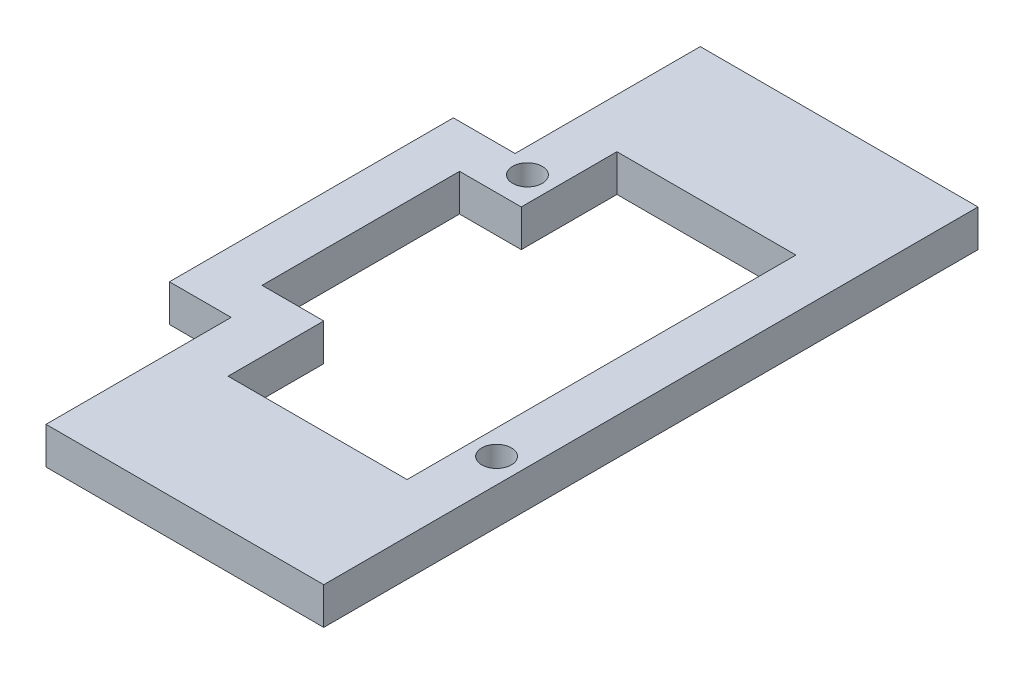
ISO-10303-21;
HEADER;
FILE_DESCRIPTION(('STEP AP214'),'2;1');
FILE_NAME('part.step','',(''),(''),'','','');
FILE_SCHEMA(('AUTOMOTIVE_DESIGN { 1 0 10303 214 1 1 1 1 }'));
ENDSEC;
DATA;
#1=APPLICATION_CONTEXT('core data for automotive mechanical design processes');
#2=APPLICATION_PROTOCOL_DEFINITION('international standard','automotive_design',2000,#1);
#3=PRODUCT_CONTEXT('',#1,'mechanical');
#4=PRODUCT('Part','Part','',(#3));
#5=PRODUCT_RELATED_PRODUCT_CATEGORY('part','',(#4));
#6=PRODUCT_DEFINITION_FORMATION('','',#4);
#7=PRODUCT_DEFINITION_CONTEXT('part definition',#1,'design');
#8=PRODUCT_DEFINITION('design','',#6,#7);
#9=PRODUCT_DEFINITION_SHAPE('','',#8);
#10=(LENGTH_UNIT() NAMED_UNIT(*) SI_UNIT(.MILLI.,.METRE.));
#11=(NAMED_UNIT(*) PLANE_ANGLE_UNIT() SI_UNIT($,.RADIAN.));
#12=(NAMED_UNIT(*) SI_UNIT($,.STERADIAN.) SOLID_ANGLE_UNIT());
#13=UNCERTAINTY_MEASURE_WITH_UNIT(LENGTH_MEASURE(1.E-05),#10,'distance_accuracy_value','');
#14=(GEOMETRIC_REPRESENTATION_CONTEXT(3) GLOBAL_UNCERTAINTY_ASSIGNED_CONTEXT((#13)) GLOBAL_UNIT_ASSIGNED_CONTEXT((#10,
#11,#12)) REPRESENTATION_CONTEXT('',''));
#15=CARTESIAN_POINT('',(0.,0.,0.));
#16=DIRECTION('',(0.,0.,1.));
#17=DIRECTION('',(1.,0.,0.));
#18=AXIS2_PLACEMENT_3D('',#15,#16,#17);
#19=CARTESIAN_POINT('',(-1.73819143978702,6.,0.));
#20=DIRECTION('',(1.,0.,0.));
#21=DIRECTION('',(0.,0.,-1.));
#22=AXIS2_PLACEMENT_3D('',#19,#20,#21);
#23=PLANE('',#22);
#24=DIRECTION('',(0.,0.,1.));
#25=VECTOR('',#24,1.);
#26=CARTESIAN_POINT('',(-1.73819143978702,0.,0.));
#27=LINE('',#26,#25);
#28=CARTESIAN_POINT('',(-1.73819143978702,0.,2.01519907728627));
#29=VERTEX_POINT('',#28);
#30=CARTESIAN_POINT('',(-1.73819143978701,0.,17.5151990772863));
#31=VERTEX_POINT('',#30);
#32=EDGE_CURVE('E231',#29,#31,#27,.T.);
#33=ORIENTED_EDGE('',*,*,#32,.F.);
#34=DIRECTION('',(0.,-1.,0.));
#35=VECTOR('',#34,1.);
#36=CARTESIAN_POINT('',(-1.73819143978702,6.,2.01519907728627));
#37=LINE('',#36,#35);
#38=CARTESIAN_POINT('',(-1.73819143978702,6.,2.01519907728627));
#39=VERTEX_POINT('',#38);
#40=EDGE_CURVE('E11',#39,#29,#37,.T.);
#41=ORIENTED_EDGE('',*,*,#40,.F.);
#42=DIRECTION('',(0.,0.,1.));
#43=VECTOR('',#42,1.);
#44=CARTESIAN_POINT('',(-1.73819143978702,6.,0.));
#45=LINE('',#44,#43);
#46=CARTESIAN_POINT('',(-1.73819143978701,6.,17.5151990772863));
#47=VERTEX_POINT('',#46);
#48=EDGE_CURVE('E267',#39,#47,#45,.T.);
#49=ORIENTED_EDGE('',*,*,#48,.T.);
#50=DIRECTION('',(0.,-1.,0.));
#51=VECTOR('',#50,1.);
#52=CARTESIAN_POINT('',(-1.73819143978701,6.,17.5151990772863));
#53=LINE('',#52,#51);
#54=EDGE_CURVE('E56',#47,#31,#53,.T.);
#55=ORIENTED_EDGE('',*,*,#54,.T.);
#56=EDGE_LOOP('',(#33,#41,#49,#55));
#57=FACE_BOUND('',#56,.T.);
#58=ADVANCED_FACE('F37',(#57),#23,.T.);
#59=CARTESIAN_POINT('',(0.,6.,2.01519907728627));
#60=DIRECTION('',(0.,0.,1.));
#61=DIRECTION('',(1.,0.,0.));
#62=AXIS2_PLACEMENT_3D('',#59,#60,#61);
#63=PLANE('',#62);
#64=DIRECTION('',(-1.,0.,0.));
#65=VECTOR('',#64,1.);
#66=CARTESIAN_POINT('',(0.,0.,2.01519907728627));
#67=LINE('',#66,#65);
#68=CARTESIAN_POINT('',(-11.738191439787,0.,2.01519907728627));
#69=VERTEX_POINT('',#68);
#70=EDGE_CURVE('E228',#29,#69,#67,.T.);
#71=ORIENTED_EDGE('',*,*,#70,.T.);
#72=DIRECTION('',(0.,-1.,0.));
#73=VECTOR('',#72,1.);
#74=CARTESIAN_POINT('',(-11.738191439787,6.,2.01519907728627));
#75=LINE('',#74,#73);
#76=CARTESIAN_POINT('',(-11.738191439787,6.,2.01519907728627));
#77=VERTEX_POINT('',#76);
#78=EDGE_CURVE('E47',#77,#69,#75,.T.);
#79=ORIENTED_EDGE('',*,*,#78,.F.);
#80=DIRECTION('',(-1.,0.,0.));
#81=VECTOR('',#80,1.);
#82=CARTESIAN_POINT('',(0.,6.,2.01519907728627));
#83=LINE('',#82,#81);
#84=EDGE_CURVE('E265',#39,#77,#83,.T.);
#85=ORIENTED_EDGE('',*,*,#84,.F.);
#86=ORIENTED_EDGE('',*,*,#40,.T.);
#87=EDGE_LOOP('',(#71,#79,#85,#86));
#88=FACE_BOUND('',#87,.T.);
#89=ADVANCED_FACE('F330',(#88),#63,.F.);
#90=CARTESIAN_POINT('',(-11.738191439787,6.,0.));
#91=DIRECTION('',(1.,0.,0.));
#92=DIRECTION('',(0.,0.,-1.));
#93=AXIS2_PLACEMENT_3D('',#90,#91,#92);
#94=PLANE('',#93);
#95=DIRECTION('',(0.,0.,1.));
#96=VECTOR('',#95,1.);
#97=CARTESIAN_POINT('',(-11.738191439787,0.,0.));
#98=LINE('',#97,#96);
#99=CARTESIAN_POINT('',(-11.738191439787,0.,-29.9848009227137));
#100=VERTEX_POINT('',#99);
#101=EDGE_CURVE('E225',#100,#69,#98,.T.);
#102=ORIENTED_EDGE('',*,*,#101,.F.);
#103=DIRECTION('',(0.,-1.,0.));
#104=VECTOR('',#103,1.);
#105=CARTESIAN_POINT('',(-11.738191439787,6.,-29.9848009227137));
#106=LINE('',#105,#104);
#107=CARTESIAN_POINT('',(-11.738191439787,6.,-29.9848009227137));
#108=VERTEX_POINT('',#107);
#109=EDGE_CURVE('E188',#108,#100,#106,.T.);
#110=ORIENTED_EDGE('',*,*,#109,.F.);
#111=DIRECTION('',(0.,0.,1.));
#112=VECTOR('',#111,1.);
#113=CARTESIAN_POINT('',(-11.738191439787,6.,0.));
#114=LINE('',#113,#112);
#115=EDGE_CURVE('E262',#108,#77,#114,.T.);
#116=ORIENTED_EDGE('',*,*,#115,.T.);
#117=ORIENTED_EDGE('',*,*,#78,.T.);
#118=EDGE_LOOP('',(#102,#110,#116,#117));
#119=FACE_BOUND('',#118,.T.);
#120=ADVANCED_FACE('F336',(#119),#94,.T.);
#121=CARTESIAN_POINT('',(0.,6.,-29.9848009227137));
#122=DIRECTION('',(0.,0.,1.));
#123=DIRECTION('',(1.,0.,0.));
#124=AXIS2_PLACEMENT_3D('',#121,#122,#123);
#125=PLANE('',#124);
#126=DIRECTION('',(-1.,0.,0.));
#127=VECTOR('',#126,1.);
#128=CARTESIAN_POINT('',(0.,0.,-29.9848009227137));
#129=LINE('',#128,#127);
#130=CARTESIAN_POINT('',(-1.73819143978702,0.,-29.9848009227137));
#131=VERTEX_POINT('',#130);
#132=EDGE_CURVE('E222',#131,#100,#129,.T.);
#133=ORIENTED_EDGE('',*,*,#132,.F.);
#134=DIRECTION('',(0.,-1.,0.));
#135=VECTOR('',#134,1.);
#136=CARTESIAN_POINT('',(-1.73819143978702,6.,-29.9848009227137));
#137=LINE('',#136,#135);
#138=CARTESIAN_POINT('',(-1.73819143978702,6.,-29.9848009227137));
#139=VERTEX_POINT('',#138);
#140=EDGE_CURVE('E182',#139,#131,#137,.T.);
#141=ORIENTED_EDGE('',*,*,#140,.F.);
#142=DIRECTION('',(-1.,0.,0.));
#143=VECTOR('',#142,1.);
#144=CARTESIAN_POINT('',(0.,6.,-29.9848009227137));
#145=LINE('',#144,#143);
#146=EDGE_CURVE('E259',#139,#108,#145,.T.);
#147=ORIENTED_EDGE('',*,*,#146,.T.);
#148=ORIENTED_EDGE('',*,*,#109,.T.);
#149=EDGE_LOOP('',(#133,#141,#147,#148));
#150=FACE_BOUND('',#149,.T.);
#151=ADVANCED_FACE('F342',(#150),#125,.T.);
#152=CARTESIAN_POINT('',(-1.73819143978702,0.,-45.4848009227137));
#153=VERTEX_POINT('',#152);
#154=EDGE_CURVE('E221',#153,#131,#27,.T.);
#155=ORIENTED_EDGE('',*,*,#154,.F.);
#156=DIRECTION('',(0.,-1.,0.));
#157=VECTOR('',#156,1.);
#158=CARTESIAN_POINT('',(-1.73819143978702,6.,-45.4848009227137));
#159=LINE('',#158,#157);
#160=CARTESIAN_POINT('',(-1.73819143978702,6.,-45.4848009227137));
#161=VERTEX_POINT('',#160);
#162=EDGE_CURVE('E180',#161,#153,#159,.T.);
#163=ORIENTED_EDGE('',*,*,#162,.F.);
#164=EDGE_CURVE('E174',#161,#139,#45,.T.);
#165=ORIENTED_EDGE('',*,*,#164,.T.);
#166=ORIENTED_EDGE('',*,*,#140,.T.);
#167=EDGE_LOOP('',(#155,#163,#165,#166));
#168=FACE_BOUND('',#167,.T.);
#169=ADVANCED_FACE('F332',(#168),#23,.T.);
#170=CARTESIAN_POINT('',(0.,6.,-45.4848009227137));
#171=DIRECTION('',(0.,0.,-1.));
#172=DIRECTION('',(-1.,0.,0.));
#173=AXIS2_PLACEMENT_3D('',#170,#171,#172);
#174=PLANE('',#173);
#175=DIRECTION('',(1.,0.,0.));
#176=VECTOR('',#175,1.);
#177=CARTESIAN_POINT('',(0.,0.,-45.4848009227137));
#178=LINE('',#177,#176);
#179=CARTESIAN_POINT('',(27.261808560213,0.,-45.4848009227137));
#180=VERTEX_POINT('',#179);
#181=EDGE_CURVE('E179',#153,#180,#178,.T.);
#182=ORIENTED_EDGE('',*,*,#181,.T.);
#183=DIRECTION('',(0.,-1.,0.));
#184=VECTOR('',#183,1.);
#185=CARTESIAN_POINT('',(27.261808560213,6.,-45.4848009227137));
#186=LINE('',#185,#184);
#187=CARTESIAN_POINT('',(27.261808560213,6.,-45.4848009227137));
#188=VERTEX_POINT('',#187);
#189=EDGE_CURVE('E161',#188,#180,#186,.T.);
#190=ORIENTED_EDGE('',*,*,#189,.F.);
#191=DIRECTION('',(1.,0.,0.));
#192=VECTOR('',#191,1.);
#193=CARTESIAN_POINT('',(0.,6.,-45.4848009227137));
#194=LINE('',#193,#192);
#195=EDGE_CURVE('E166',#161,#188,#194,.T.);
#196=ORIENTED_EDGE('',*,*,#195,.F.);
#197=ORIENTED_EDGE('',*,*,#162,.T.);
#198=EDGE_LOOP('',(#182,#190,#196,#197));
#199=FACE_BOUND('',#198,.T.);
#200=ADVANCED_FACE('F177',(#199),#174,.F.);
#201=CARTESIAN_POINT('',(27.261808560213,6.,0.));
#202=DIRECTION('',(1.,0.,0.));
#203=DIRECTION('',(0.,0.,-1.));
#204=AXIS2_PLACEMENT_3D('',#201,#202,#203);
#205=PLANE('',#204);
#206=DIRECTION('',(0.,0.,1.));
#207=VECTOR('',#206,1.);
#208=CARTESIAN_POINT('',(27.261808560213,0.,0.));
#209=LINE('',#208,#207);
#210=CARTESIAN_POINT('',(27.261808560213,0.,17.5151990772863));
#211=VERTEX_POINT('',#210);
#212=EDGE_CURVE('E218',#180,#211,#209,.T.);
#213=ORIENTED_EDGE('',*,*,#212,.T.);
#214=DIRECTION('',(0.,-1.,0.));
#215=VECTOR('',#214,1.);
#216=CARTESIAN_POINT('',(27.261808560213,6.,17.5151990772863));
#217=LINE('',#216,#215);
#218=CARTESIAN_POINT('',(27.261808560213,6.,17.5151990772863));
#219=VERTEX_POINT('',#218);
#220=EDGE_CURVE('E106',#219,#211,#217,.T.);
#221=ORIENTED_EDGE('',*,*,#220,.F.);
#222=DIRECTION('',(0.,0.,1.));
#223=VECTOR('',#222,1.);
#224=CARTESIAN_POINT('',(27.261808560213,6.,0.));
#225=LINE('',#224,#223);
#226=EDGE_CURVE('E157',#188,#219,#225,.T.);
#227=ORIENTED_EDGE('',*,*,#226,.F.);
#228=ORIENTED_EDGE('',*,*,#189,.T.);
#229=EDGE_LOOP('',(#213,#221,#227,#228));
#230=FACE_BOUND('',#229,.T.);
#231=ADVANCED_FACE('F159',(#230),#205,.F.);
#232=CARTESIAN_POINT('',(0.,6.,9.01519907728628));
#233=DIRECTION('',(0.,0.,1.));
#234=DIRECTION('',(1.,0.,0.));
#235=AXIS2_PLACEMENT_3D('',#232,#233,#234);
#236=PLANE('',#235);
#237=DIRECTION('',(-1.,0.,0.));
#238=VECTOR('',#237,1.);
#239=CARTESIAN_POINT('',(0.,0.,9.01519907728628));
#240=LINE('',#239,#238);
#241=CARTESIAN_POINT('',(-9.73819143978701,0.,9.01519907728628));
#242=VERTEX_POINT('',#241);
#243=CARTESIAN_POINT('',(-19.738191439787,0.,9.01519907728628));
#244=VERTEX_POINT('',#243);
#245=EDGE_CURVE('E255',#242,#244,#240,.T.);
#246=ORIENTED_EDGE('',*,*,#245,.F.);
#247=DIRECTION('',(0.,-1.,0.));
#248=VECTOR('',#247,1.);
#249=CARTESIAN_POINT('',(-9.73819143978701,6.,9.01519907728628));
#250=LINE('',#249,#248);
#251=CARTESIAN_POINT('',(-9.73819143978701,6.,9.01519907728628));
#252=VERTEX_POINT('',#251);
#253=EDGE_CURVE('E41',#252,#242,#250,.T.);
#254=ORIENTED_EDGE('',*,*,#253,.F.);
#255=DIRECTION('',(-1.,0.,0.));
#256=VECTOR('',#255,1.);
#257=CARTESIAN_POINT('',(0.,6.,9.01519907728628));
#258=LINE('',#257,#256);
#259=CARTESIAN_POINT('',(-19.738191439787,6.,9.01519907728628));
#260=VERTEX_POINT('',#259);
#261=EDGE_CURVE('E217',#252,#260,#258,.T.);
#262=ORIENTED_EDGE('',*,*,#261,.T.);
#263=DIRECTION('',(0.,-1.,0.));
#264=VECTOR('',#263,1.);
#265=CARTESIAN_POINT('',(-19.738191439787,6.,9.01519907728628));
#266=LINE('',#265,#264);
#267=EDGE_CURVE('E191',#260,#244,#266,.T.);
#268=ORIENTED_EDGE('',*,*,#267,.T.);
#269=EDGE_LOOP('',(#246,#254,#262,#268));
#270=FACE_BOUND('',#269,.T.);
#271=ADVANCED_FACE('F39',(#270),#236,.T.);
#272=CARTESIAN_POINT('',(-9.73819143978702,6.,0.));
#273=DIRECTION('',(1.,0.,0.));
#274=DIRECTION('',(0.,0.,-1.));
#275=AXIS2_PLACEMENT_3D('',#272,#273,#274);
#276=PLANE('',#275);
#277=DIRECTION('',(0.,0.,1.));
#278=VECTOR('',#277,1.);
#279=CARTESIAN_POINT('',(-9.73819143978702,0.,0.));
#280=LINE('',#279,#278);
#281=CARTESIAN_POINT('',(-9.73819143978701,0.,39.0151990772863));
#282=VERTEX_POINT('',#281);
#283=EDGE_CURVE('E253',#242,#282,#280,.T.);
#284=ORIENTED_EDGE('',*,*,#283,.T.);
#285=DIRECTION('',(0.,-1.,0.));
#286=VECTOR('',#285,1.);
#287=CARTESIAN_POINT('',(-9.73819143978701,6.,39.0151990772863));
#288=LINE('',#287,#286);
#289=CARTESIAN_POINT('',(-9.73819143978701,6.,39.0151990772863));
#290=VERTEX_POINT('',#289);
#291=EDGE_CURVE('E204',#290,#282,#288,.T.);
#292=ORIENTED_EDGE('',*,*,#291,.F.);
#293=DIRECTION('',(0.,0.,1.));
#294=VECTOR('',#293,1.);
#295=CARTESIAN_POINT('',(-9.73819143978702,6.,0.));
#296=LINE('',#295,#294);
#297=EDGE_CURVE('E288',#252,#290,#296,.T.);
#298=ORIENTED_EDGE('',*,*,#297,.F.);
#299=ORIENTED_EDGE('',*,*,#253,.T.);
#300=EDGE_LOOP('',(#284,#292,#298,#299));
#301=FACE_BOUND('',#300,.T.);
#302=ADVANCED_FACE('F304',(#301),#276,.F.);
#303=CARTESIAN_POINT('',(0.,6.,39.0151990772863));
#304=DIRECTION('',(0.,0.,-1.));
#305=DIRECTION('',(-1.,0.,0.));
#306=AXIS2_PLACEMENT_3D('',#303,#304,#305);
#307=PLANE('',#306);
#308=DIRECTION('',(1.,0.,0.));
#309=VECTOR('',#308,1.);
#310=CARTESIAN_POINT('',(0.,0.,39.0151990772863));
#311=LINE('',#310,#309);
#312=CARTESIAN_POINT('',(35.261808560213,0.,39.0151990772863));
#313=VERTEX_POINT('',#312);
#314=EDGE_CURVE('E251',#282,#313,#311,.T.);
#315=ORIENTED_EDGE('',*,*,#314,.T.);
#316=DIRECTION('',(0.,-1.,0.));
#317=VECTOR('',#316,1.);
#318=CARTESIAN_POINT('',(35.261808560213,6.,39.0151990772863));
#319=LINE('',#318,#317);
#320=CARTESIAN_POINT('',(35.261808560213,6.,39.0151990772863));
#321=VERTEX_POINT('',#320);
#322=EDGE_CURVE('E203',#321,#313,#319,.T.);
#323=ORIENTED_EDGE('',*,*,#322,.F.);
#324=DIRECTION('',(1.,0.,0.));
#325=VECTOR('',#324,1.);
#326=CARTESIAN_POINT('',(0.,6.,39.0151990772863));
#327=LINE('',#326,#325);
#328=EDGE_CURVE('E286',#290,#321,#327,.T.);
#329=ORIENTED_EDGE('',*,*,#328,.F.);
#330=ORIENTED_EDGE('',*,*,#291,.T.);
#331=EDGE_LOOP('',(#315,#323,#329,#330));
#332=FACE_BOUND('',#331,.T.);
#333=ADVANCED_FACE('F306',(#332),#307,.F.);
#334=CARTESIAN_POINT('',(35.261808560213,6.,0.));
#335=DIRECTION('',(1.,0.,0.));
#336=DIRECTION('',(0.,0.,-1.));
#337=AXIS2_PLACEMENT_3D('',#334,#335,#336);
#338=PLANE('',#337);
#339=DIRECTION('',(0.,0.,1.));
#340=VECTOR('',#339,1.);
#341=CARTESIAN_POINT('',(35.261808560213,0.,0.));
#342=LINE('',#341,#340);
#343=CARTESIAN_POINT('',(35.261808560213,0.,-66.9848009227137));
#344=VERTEX_POINT('',#343);
#345=EDGE_CURVE('E248',#344,#313,#342,.T.);
#346=ORIENTED_EDGE('',*,*,#345,.F.);
#347=DIRECTION('',(0.,-1.,0.));
#348=VECTOR('',#347,1.);
#349=CARTESIAN_POINT('',(35.261808560213,6.,-66.9848009227137));
#350=LINE('',#349,#348);
#351=CARTESIAN_POINT('',(35.261808560213,6.,-66.9848009227137));
#352=VERTEX_POINT('',#351);
#353=EDGE_CURVE('E201',#352,#344,#350,.T.);
#354=ORIENTED_EDGE('',*,*,#353,.F.);
#355=DIRECTION('',(0.,0.,1.));
#356=VECTOR('',#355,1.);
#357=CARTESIAN_POINT('',(35.261808560213,6.,0.));
#358=LINE('',#357,#356);
#359=EDGE_CURVE('E283',#352,#321,#358,.T.);
#360=ORIENTED_EDGE('',*,*,#359,.T.);
#361=ORIENTED_EDGE('',*,*,#322,.T.);
#362=EDGE_LOOP('',(#346,#354,#360,#361));
#363=FACE_BOUND('',#362,.T.);
#364=ADVANCED_FACE('F321',(#363),#338,.T.);
#365=CARTESIAN_POINT('',(0.,6.,-66.9848009227137));
#366=DIRECTION('',(0.,0.,-1.));
#367=DIRECTION('',(-1.,0.,0.));
#368=AXIS2_PLACEMENT_3D('',#365,#366,#367);
#369=PLANE('',#368);
#370=DIRECTION('',(1.,0.,0.));
#371=VECTOR('',#370,1.);
#372=CARTESIAN_POINT('',(0.,0.,-66.9848009227137));
#373=LINE('',#372,#371);
#374=CARTESIAN_POINT('',(-9.73819143978703,0.,-66.9848009227137));
#375=VERTEX_POINT('',#374);
#376=EDGE_CURVE('E245',#375,#344,#373,.T.);
#377=ORIENTED_EDGE('',*,*,#376,.F.);
#378=DIRECTION('',(0.,-1.,0.));
#379=VECTOR('',#378,1.);
#380=CARTESIAN_POINT('',(-9.73819143978703,6.,-66.9848009227137));
#381=LINE('',#380,#379);
#382=CARTESIAN_POINT('',(-9.73819143978703,6.,-66.9848009227137));
#383=VERTEX_POINT('',#382);
#384=EDGE_CURVE('E199',#383,#375,#381,.T.);
#385=ORIENTED_EDGE('',*,*,#384,.F.);
#386=DIRECTION('',(1.,0.,0.));
#387=VECTOR('',#386,1.);
#388=CARTESIAN_POINT('',(0.,6.,-66.9848009227137));
#389=LINE('',#388,#387);
#390=EDGE_CURVE('E280',#383,#352,#389,.T.);
#391=ORIENTED_EDGE('',*,*,#390,.T.);
#392=ORIENTED_EDGE('',*,*,#353,.T.);
#393=EDGE_LOOP('',(#377,#385,#391,#392));
#394=FACE_BOUND('',#393,.T.);
#395=ADVANCED_FACE('F312',(#394),#369,.T.);
#396=CARTESIAN_POINT('',(-9.73819143978702,0.,-36.9848009227137));
#397=VERTEX_POINT('',#396);
#398=EDGE_CURVE('E244',#375,#397,#280,.T.);
#399=ORIENTED_EDGE('',*,*,#398,.T.);
#400=DIRECTION('',(0.,-1.,0.));
#401=VECTOR('',#400,1.);
#402=CARTESIAN_POINT('',(-9.73819143978702,6.,-36.9848009227137));
#403=LINE('',#402,#401);
#404=CARTESIAN_POINT('',(-9.73819143978702,6.,-36.9848009227137));
#405=VERTEX_POINT('',#404);
#406=EDGE_CURVE('E196',#405,#397,#403,.T.);
#407=ORIENTED_EDGE('',*,*,#406,.F.);
#408=EDGE_CURVE('E279',#383,#405,#296,.T.);
#409=ORIENTED_EDGE('',*,*,#408,.F.);
#410=ORIENTED_EDGE('',*,*,#384,.T.);
#411=EDGE_LOOP('',(#399,#407,#409,#410));
#412=FACE_BOUND('',#411,.T.);
#413=ADVANCED_FACE('F318',(#412),#276,.F.);
#414=CARTESIAN_POINT('',(0.,6.,-36.9848009227137));
#415=DIRECTION('',(0.,0.,1.));
#416=DIRECTION('',(1.,0.,0.));
#417=AXIS2_PLACEMENT_3D('',#414,#415,#416);
#418=PLANE('',#417);
#419=DIRECTION('',(-1.,0.,0.));
#420=VECTOR('',#419,1.);
#421=CARTESIAN_POINT('',(0.,0.,-36.9848009227137));
#422=LINE('',#421,#420);
#423=CARTESIAN_POINT('',(-19.738191439787,0.,-36.9848009227137));
#424=VERTEX_POINT('',#423);
#425=EDGE_CURVE('E242',#397,#424,#422,.T.);
#426=ORIENTED_EDGE('',*,*,#425,.T.);
#427=DIRECTION('',(0.,-1.,0.));
#428=VECTOR('',#427,1.);
#429=CARTESIAN_POINT('',(-19.738191439787,6.,-36.9848009227137));
#430=LINE('',#429,#428);
#431=CARTESIAN_POINT('',(-19.738191439787,6.,-36.9848009227137));
#432=VERTEX_POINT('',#431);
#433=EDGE_CURVE('E193',#432,#424,#430,.T.);
#434=ORIENTED_EDGE('',*,*,#433,.F.);
#435=DIRECTION('',(-1.,0.,0.));
#436=VECTOR('',#435,1.);
#437=CARTESIAN_POINT('',(0.,6.,-36.9848009227137));
#438=LINE('',#437,#436);
#439=EDGE_CURVE('E277',#405,#432,#438,.T.);
#440=ORIENTED_EDGE('',*,*,#439,.F.);
#441=ORIENTED_EDGE('',*,*,#406,.T.);
#442=EDGE_LOOP('',(#426,#434,#440,#441));
#443=FACE_BOUND('',#442,.T.);
#444=ADVANCED_FACE('F320',(#443),#418,.F.);
#445=CARTESIAN_POINT('',(-5.73819143978702,6.,-34.9848009227137));
#446=DIRECTION('',(0.,-1.,0.));
#447=DIRECTION('',(0.,0.,-1.));
#448=AXIS2_PLACEMENT_3D('',#445,#446,#447);
#449=CYLINDRICAL_SURFACE('',#448,2.4);
#450=CARTESIAN_POINT('',(-5.73819143978702,6.,-34.9848009227137));
#451=DIRECTION('',(0.,1.,0.));
#452=DIRECTION('',(0.,0.,1.));
#453=AXIS2_PLACEMENT_3D('',#450,#451,#452);
#454=CIRCLE('',#453,2.4);
#455=CARTESIAN_POINT('',(-5.73819143978702,6.,-32.5848009227137));
#456=VERTEX_POINT('',#455);
#457=EDGE_CURVE('E269',#456,#456,#454,.T.);
#458=ORIENTED_EDGE('',*,*,#457,.T.);
#459=EDGE_LOOP('',(#458));
#460=FACE_BOUND('',#459,.T.);
#461=CARTESIAN_POINT('',(-5.73819143978702,0.,-34.9848009227137));
#462=DIRECTION('',(0.,1.,0.));
#463=DIRECTION('',(0.,0.,1.));
#464=AXIS2_PLACEMENT_3D('',#461,#462,#463);
#465=CIRCLE('',#464,2.4);
#466=CARTESIAN_POINT('',(-5.73819143978702,0.,-32.5848009227137));
#467=VERTEX_POINT('',#466);
#468=EDGE_CURVE('E233',#467,#467,#465,.T.);
#469=ORIENTED_EDGE('',*,*,#468,.F.);
#470=EDGE_LOOP('',(#469));
#471=FACE_BOUND('',#470,.T.);
#472=ADVANCED_FACE('F381',(#460,#471),#449,.F.);
#473=CARTESIAN_POINT('',(31.261808560213,6.,7.01519907728627));
#474=DIRECTION('',(0.,-1.,0.));
#475=DIRECTION('',(0.,0.,-1.));
#476=AXIS2_PLACEMENT_3D('',#473,#474,#475);
#477=CYLINDRICAL_SURFACE('',#476,2.4);
#478=CARTESIAN_POINT('',(31.261808560213,6.,7.01519907728627));
#479=DIRECTION('',(0.,1.,0.));
#480=DIRECTION('',(0.,0.,1.));
#481=AXIS2_PLACEMENT_3D('',#478,#479,#480);
#482=CIRCLE('',#481,2.4);
#483=CARTESIAN_POINT('',(31.261808560213,6.,9.41519907728627));
#484=VERTEX_POINT('',#483);
#485=EDGE_CURVE('E272',#484,#484,#482,.T.);
#486=ORIENTED_EDGE('',*,*,#485,.T.);
#487=EDGE_LOOP('',(#486));
#488=FACE_BOUND('',#487,.T.);
#489=CARTESIAN_POINT('',(31.261808560213,0.,7.01519907728627));
#490=DIRECTION('',(0.,1.,0.));
#491=DIRECTION('',(0.,0.,1.));
#492=AXIS2_PLACEMENT_3D('',#489,#490,#491);
#493=CIRCLE('',#492,2.4);
#494=CARTESIAN_POINT('',(31.261808560213,0.,9.41519907728627));
#495=VERTEX_POINT('',#494);
#496=EDGE_CURVE('E236',#495,#495,#493,.T.);
#497=ORIENTED_EDGE('',*,*,#496,.F.);
#498=EDGE_LOOP('',(#497));
#499=FACE_BOUND('',#498,.T.);
#500=ADVANCED_FACE('F362',(#488,#499),#477,.F.);
#501=CARTESIAN_POINT('',(-19.738191439787,6.,0.));
#502=DIRECTION('',(1.,0.,0.));
#503=DIRECTION('',(0.,0.,-1.));
#504=AXIS2_PLACEMENT_3D('',#501,#502,#503);
#505=PLANE('',#504);
#506=DIRECTION('',(0.,0.,1.));
#507=VECTOR('',#506,1.);
#508=CARTESIAN_POINT('',(-19.738191439787,0.,0.));
#509=LINE('',#508,#507);
#510=EDGE_CURVE('E239',#424,#244,#509,.T.);
#511=ORIENTED_EDGE('',*,*,#510,.T.);
#512=ORIENTED_EDGE('',*,*,#267,.F.);
#513=DIRECTION('',(0.,0.,1.));
#514=VECTOR('',#513,1.);
#515=CARTESIAN_POINT('',(-19.738191439787,6.,0.));
#516=LINE('',#515,#514);
#517=EDGE_CURVE('E275',#432,#260,#516,.T.);
#518=ORIENTED_EDGE('',*,*,#517,.F.);
#519=ORIENTED_EDGE('',*,*,#433,.T.);
#520=EDGE_LOOP('',(#511,#512,#518,#519));
#521=FACE_BOUND('',#520,.T.);
#522=ADVANCED_FACE('F298',(#521),#505,.F.);
#523=CARTESIAN_POINT('',(0.,6.,17.5151990772863));
#524=DIRECTION('',(0.,0.,-1.));
#525=DIRECTION('',(-1.,0.,0.));
#526=AXIS2_PLACEMENT_3D('',#523,#524,#525);
#527=PLANE('',#526);
#528=DIRECTION('',(1.,0.,0.));
#529=VECTOR('',#528,1.);
#530=CARTESIAN_POINT('',(0.,0.,17.5151990772863));
#531=LINE('',#530,#529);
#532=EDGE_CURVE('E214',#31,#211,#531,.T.);
#533=ORIENTED_EDGE('',*,*,#532,.F.);
#534=ORIENTED_EDGE('',*,*,#54,.F.);
#535=DIRECTION('',(1.,0.,0.));
#536=VECTOR('',#535,1.);
#537=CARTESIAN_POINT('',(0.,6.,17.5151990772863));
#538=LINE('',#537,#536);
#539=EDGE_CURVE('E165',#47,#219,#538,.T.);
#540=ORIENTED_EDGE('',*,*,#539,.T.);
#541=ORIENTED_EDGE('',*,*,#220,.T.);
#542=EDGE_LOOP('',(#533,#534,#540,#541));
#543=FACE_BOUND('',#542,.T.);
#544=ADVANCED_FACE('F354',(#543),#527,.T.);
#545=CARTESIAN_POINT('',(0.,6.,0.));
#546=DIRECTION('',(0.,1.,0.));
#547=DIRECTION('',(0.,0.,1.));
#548=AXIS2_PLACEMENT_3D('',#545,#546,#547);
#549=PLANE('',#548);
#550=ORIENTED_EDGE('',*,*,#261,.F.);
#551=ORIENTED_EDGE('',*,*,#297,.T.);
#552=ORIENTED_EDGE('',*,*,#328,.T.);
#553=ORIENTED_EDGE('',*,*,#359,.F.);
#554=ORIENTED_EDGE('',*,*,#390,.F.);
#555=ORIENTED_EDGE('',*,*,#408,.T.);
#556=ORIENTED_EDGE('',*,*,#439,.T.);
#557=ORIENTED_EDGE('',*,*,#517,.T.);
#558=EDGE_LOOP('',(#550,#551,#552,#553,#554,#555,#556,#557));
#559=FACE_BOUND('',#558,.T.);
#560=ORIENTED_EDGE('',*,*,#485,.F.);
#561=EDGE_LOOP('',(#560));
#562=FACE_BOUND('',#561,.T.);
#563=ORIENTED_EDGE('',*,*,#457,.F.);
#564=EDGE_LOOP('',(#563));
#565=FACE_BOUND('',#564,.T.);
#566=ORIENTED_EDGE('',*,*,#48,.F.);
#567=ORIENTED_EDGE('',*,*,#84,.T.);
#568=ORIENTED_EDGE('',*,*,#115,.F.);
#569=ORIENTED_EDGE('',*,*,#146,.F.);
#570=ORIENTED_EDGE('',*,*,#164,.F.);
#571=ORIENTED_EDGE('',*,*,#195,.T.);
#572=ORIENTED_EDGE('',*,*,#226,.T.);
#573=ORIENTED_EDGE('',*,*,#539,.F.);
#574=EDGE_LOOP('',(#566,#567,#568,#569,#570,#571,#572,#573));
#575=FACE_BOUND('',#574,.T.);
#576=ADVANCED_FACE('F171',(#559,#562,#565,#575),#549,.T.);
#577=CARTESIAN_POINT('',(0.,0.,0.));
#578=DIRECTION('',(0.,1.,0.));
#579=DIRECTION('',(0.,0.,1.));
#580=AXIS2_PLACEMENT_3D('',#577,#578,#579);
#581=PLANE('',#580);
#582=ORIENTED_EDGE('',*,*,#245,.T.);
#583=ORIENTED_EDGE('',*,*,#510,.F.);
#584=ORIENTED_EDGE('',*,*,#425,.F.);
#585=ORIENTED_EDGE('',*,*,#398,.F.);
#586=ORIENTED_EDGE('',*,*,#376,.T.);
#587=ORIENTED_EDGE('',*,*,#345,.T.);
#588=ORIENTED_EDGE('',*,*,#314,.F.);
#589=ORIENTED_EDGE('',*,*,#283,.F.);
#590=EDGE_LOOP('',(#582,#583,#584,#585,#586,#587,#588,#589));
#591=FACE_BOUND('',#590,.T.);
#592=ORIENTED_EDGE('',*,*,#496,.T.);
#593=EDGE_LOOP('',(#592));
#594=FACE_BOUND('',#593,.T.);
#595=ORIENTED_EDGE('',*,*,#468,.T.);
#596=EDGE_LOOP('',(#595));
#597=FACE_BOUND('',#596,.T.);
#598=ORIENTED_EDGE('',*,*,#32,.T.);
#599=ORIENTED_EDGE('',*,*,#532,.T.);
#600=ORIENTED_EDGE('',*,*,#212,.F.);
#601=ORIENTED_EDGE('',*,*,#181,.F.);
#602=ORIENTED_EDGE('',*,*,#154,.T.);
#603=ORIENTED_EDGE('',*,*,#132,.T.);
#604=ORIENTED_EDGE('',*,*,#101,.T.);
#605=ORIENTED_EDGE('',*,*,#70,.F.);
#606=EDGE_LOOP('',(#598,#599,#600,#601,#602,#603,#604,#605));
#607=FACE_BOUND('',#606,.T.);
#608=ADVANCED_FACE('F302',(#591,#594,#597,#607),#581,.F.);
#609=CLOSED_SHELL('',(#58,#89,#120,#151,#169,#200,#231,#271,#302,#333,#364,#395,#413,#444,#472,
#500,#522,#544,#576,#608));
#610=MANIFOLD_SOLID_BREP('B2',#609);
#611=ADVANCED_BREP_SHAPE_REPRESENTATION('',(#18,#610),#14);
#612=SHAPE_DEFINITION_REPRESENTATION(#9,#611);
ENDSEC;
END-ISO-10303-21;
